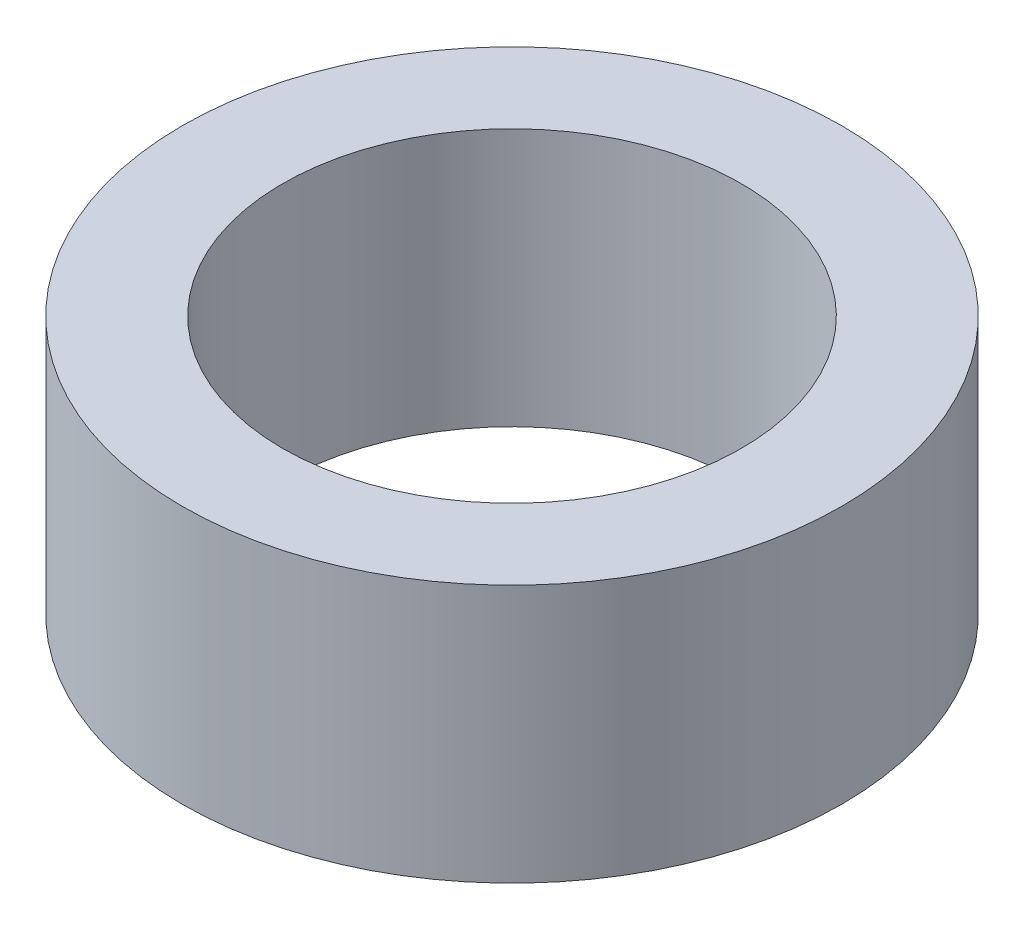
ISO-10303-21;
HEADER;
FILE_DESCRIPTION(('STEP AP214'),'2;1');
FILE_NAME('part.step','',(''),(''),'','','');
FILE_SCHEMA(('AUTOMOTIVE_DESIGN { 1 0 10303 214 1 1 1 1 }'));
ENDSEC;
DATA;
#1=APPLICATION_CONTEXT('core data for automotive mechanical design processes');
#2=APPLICATION_PROTOCOL_DEFINITION('international standard','automotive_design',2000,#1);
#3=PRODUCT_CONTEXT('',#1,'mechanical');
#4=PRODUCT('Part','Part','',(#3));
#5=PRODUCT_RELATED_PRODUCT_CATEGORY('part','',(#4));
#6=PRODUCT_DEFINITION_FORMATION('','',#4);
#7=PRODUCT_DEFINITION_CONTEXT('part definition',#1,'design');
#8=PRODUCT_DEFINITION('design','',#6,#7);
#9=PRODUCT_DEFINITION_SHAPE('','',#8);
#10=(LENGTH_UNIT() NAMED_UNIT(*) SI_UNIT(.MILLI.,.METRE.));
#11=(NAMED_UNIT(*) PLANE_ANGLE_UNIT() SI_UNIT($,.RADIAN.));
#12=(NAMED_UNIT(*) SI_UNIT($,.STERADIAN.) SOLID_ANGLE_UNIT());
#13=UNCERTAINTY_MEASURE_WITH_UNIT(LENGTH_MEASURE(1.E-05),#10,'distance_accuracy_value','');
#14=(GEOMETRIC_REPRESENTATION_CONTEXT(3) GLOBAL_UNCERTAINTY_ASSIGNED_CONTEXT((#13)) GLOBAL_UNIT_ASSIGNED_CONTEXT((#10,
#11,#12)) REPRESENTATION_CONTEXT('',''));
#15=CARTESIAN_POINT('',(0.,0.,0.));
#16=DIRECTION('',(0.,0.,1.));
#17=DIRECTION('',(1.,0.,0.));
#18=AXIS2_PLACEMENT_3D('',#15,#16,#17);
#19=CARTESIAN_POINT('',(0.,1.8,0.));
#20=DIRECTION('',(0.,1.,0.));
#21=DIRECTION('',(0.,0.,1.));
#22=AXIS2_PLACEMENT_3D('',#19,#20,#21);
#23=PLANE('',#22);
#24=CARTESIAN_POINT('',(0.,1.8,0.));
#25=DIRECTION('',(0.,1.,0.));
#26=DIRECTION('',(0.,0.,1.));
#27=AXIS2_PLACEMENT_3D('',#24,#25,#26);
#28=CIRCLE('',#27,2.3);
#29=CARTESIAN_POINT('',(0.,1.8,2.3));
#30=VERTEX_POINT('',#29);
#31=EDGE_CURVE('E10',#30,#30,#28,.T.);
#32=ORIENTED_EDGE('',*,*,#31,.T.);
#33=EDGE_LOOP('',(#32));
#34=FACE_BOUND('',#33,.T.);
#35=CARTESIAN_POINT('',(0.,1.8,0.));
#36=DIRECTION('',(0.,1.,0.));
#37=DIRECTION('',(0.,0.,1.));
#38=AXIS2_PLACEMENT_3D('',#35,#36,#37);
#39=CIRCLE('',#38,1.6);
#40=CARTESIAN_POINT('',(0.,1.8,1.6));
#41=VERTEX_POINT('',#40);
#42=EDGE_CURVE('E44',#41,#41,#39,.T.);
#43=ORIENTED_EDGE('',*,*,#42,.F.);
#44=EDGE_LOOP('',(#43));
#45=FACE_BOUND('',#44,.T.);
#46=ADVANCED_FACE('F33',(#34,#45),#23,.T.);
#47=CARTESIAN_POINT('',(0.,0.,0.));
#48=DIRECTION('',(0.,1.,0.));
#49=DIRECTION('',(0.,0.,1.));
#50=AXIS2_PLACEMENT_3D('',#47,#48,#49);
#51=PLANE('',#50);
#52=CARTESIAN_POINT('',(0.,0.,0.));
#53=DIRECTION('',(0.,1.,0.));
#54=DIRECTION('',(0.,0.,1.));
#55=AXIS2_PLACEMENT_3D('',#52,#53,#54);
#56=CIRCLE('',#55,2.3);
#57=CARTESIAN_POINT('',(0.,0.,2.3));
#58=VERTEX_POINT('',#57);
#59=EDGE_CURVE('E37',#58,#58,#56,.T.);
#60=ORIENTED_EDGE('',*,*,#59,.F.);
#61=EDGE_LOOP('',(#60));
#62=FACE_BOUND('',#61,.T.);
#63=CARTESIAN_POINT('',(0.,0.,0.));
#64=DIRECTION('',(0.,1.,0.));
#65=DIRECTION('',(0.,0.,1.));
#66=AXIS2_PLACEMENT_3D('',#63,#64,#65);
#67=CIRCLE('',#66,1.6);
#68=CARTESIAN_POINT('',(0.,0.,1.6));
#69=VERTEX_POINT('',#68);
#70=EDGE_CURVE('E46',#69,#69,#67,.T.);
#71=ORIENTED_EDGE('',*,*,#70,.T.);
#72=EDGE_LOOP('',(#71));
#73=FACE_BOUND('',#72,.T.);
#74=ADVANCED_FACE('F56',(#62,#73),#51,.F.);
#75=CARTESIAN_POINT('',(0.,1.8,0.));
#76=DIRECTION('',(0.,-1.,0.));
#77=DIRECTION('',(0.,0.,-1.));
#78=AXIS2_PLACEMENT_3D('',#75,#76,#77);
#79=CYLINDRICAL_SURFACE('',#78,2.3);
#80=ORIENTED_EDGE('',*,*,#31,.F.);
#81=EDGE_LOOP('',(#80));
#82=FACE_BOUND('',#81,.T.);
#83=ORIENTED_EDGE('',*,*,#59,.T.);
#84=EDGE_LOOP('',(#83));
#85=FACE_BOUND('',#84,.T.);
#86=ADVANCED_FACE('F35',(#82,#85),#79,.T.);
#87=CARTESIAN_POINT('',(0.,1.8,0.));
#88=DIRECTION('',(0.,-1.,0.));
#89=DIRECTION('',(0.,0.,-1.));
#90=AXIS2_PLACEMENT_3D('',#87,#88,#89);
#91=CYLINDRICAL_SURFACE('',#90,1.6);
#92=ORIENTED_EDGE('',*,*,#42,.T.);
#93=EDGE_LOOP('',(#92));
#94=FACE_BOUND('',#93,.T.);
#95=ORIENTED_EDGE('',*,*,#70,.F.);
#96=EDGE_LOOP('',(#95));
#97=FACE_BOUND('',#96,.T.);
#98=ADVANCED_FACE('F52',(#94,#97),#91,.F.);
#99=CLOSED_SHELL('',(#46,#74,#86,#98));
#100=MANIFOLD_SOLID_BREP('B2',#99);
#101=ADVANCED_BREP_SHAPE_REPRESENTATION('',(#18,#100),#14);
#102=SHAPE_DEFINITION_REPRESENTATION(#9,#101);
ENDSEC;
END-ISO-10303-21;
